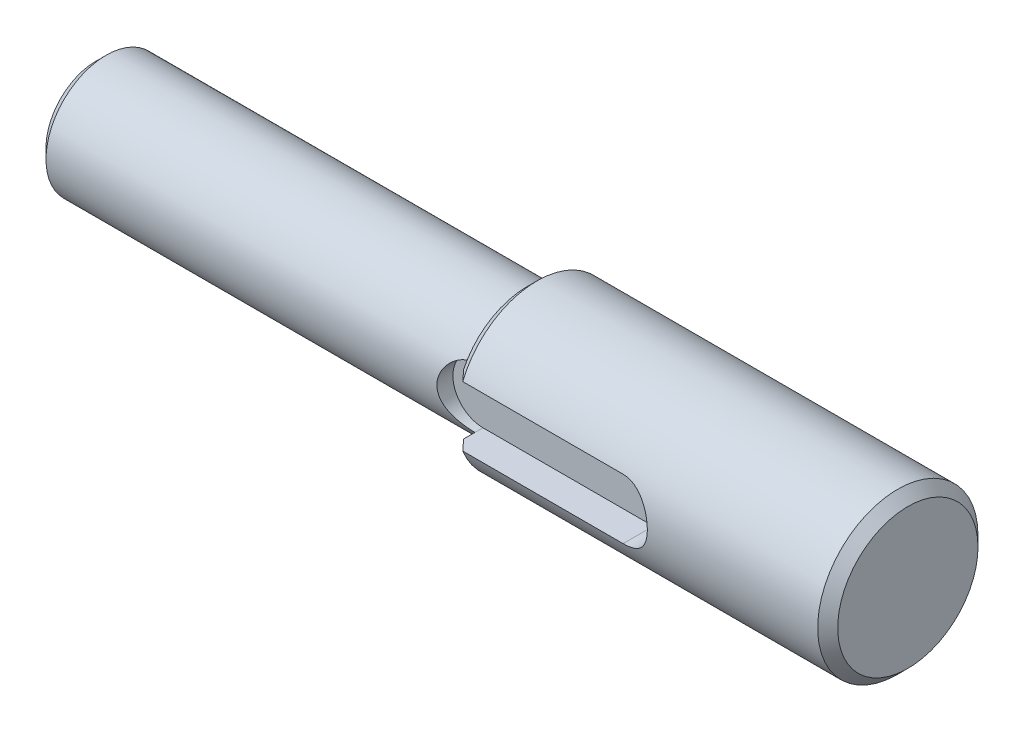
ISO-10303-21;
HEADER;
FILE_DESCRIPTION(('STEP AP214'),'2;1');
FILE_NAME('part.step','',(''),(''),'','','');
FILE_SCHEMA(('AUTOMOTIVE_DESIGN { 1 0 10303 214 1 1 1 1 }'));
ENDSEC;
DATA;
#1=APPLICATION_CONTEXT('core data for automotive mechanical design processes');
#2=APPLICATION_PROTOCOL_DEFINITION('international standard','automotive_design',2000,#1);
#3=PRODUCT_CONTEXT('',#1,'mechanical');
#4=PRODUCT('Part','Part','',(#3));
#5=PRODUCT_RELATED_PRODUCT_CATEGORY('part','',(#4));
#6=PRODUCT_DEFINITION_FORMATION('','',#4);
#7=PRODUCT_DEFINITION_CONTEXT('part definition',#1,'design');
#8=PRODUCT_DEFINITION('design','',#6,#7);
#9=PRODUCT_DEFINITION_SHAPE('','',#8);
#10=(LENGTH_UNIT() NAMED_UNIT(*) SI_UNIT(.MILLI.,.METRE.));
#11=(NAMED_UNIT(*) PLANE_ANGLE_UNIT() SI_UNIT($,.RADIAN.));
#12=(NAMED_UNIT(*) SI_UNIT($,.STERADIAN.) SOLID_ANGLE_UNIT());
#13=UNCERTAINTY_MEASURE_WITH_UNIT(LENGTH_MEASURE(1.E-05),#10,'distance_accuracy_value','');
#14=(GEOMETRIC_REPRESENTATION_CONTEXT(3) GLOBAL_UNCERTAINTY_ASSIGNED_CONTEXT((#13)) GLOBAL_UNIT_ASSIGNED_CONTEXT((#10,
#11,#12)) REPRESENTATION_CONTEXT('',''));
#15=CARTESIAN_POINT('',(0.,0.,0.));
#16=DIRECTION('',(0.,0.,1.));
#17=DIRECTION('',(1.,0.,0.));
#18=AXIS2_PLACEMENT_3D('',#15,#16,#17);
#19=CARTESIAN_POINT('',(-21.5,0.,0.));
#20=DIRECTION('',(1.,0.,0.));
#21=DIRECTION('',(0.,0.,-1.));
#22=AXIS2_PLACEMENT_3D('',#19,#20,#21);
#23=PLANE('',#22);
#24=CARTESIAN_POINT('',(-21.5,0.,0.));
#25=DIRECTION('',(1.,0.,0.));
#26=DIRECTION('',(0.,0.,-1.));
#27=AXIS2_PLACEMENT_3D('',#24,#25,#26);
#28=CIRCLE('',#27,2.5);
#29=CARTESIAN_POINT('',(-21.5,0.,-2.5));
#30=VERTEX_POINT('',#29);
#31=EDGE_CURVE('E272',#30,#30,#28,.T.);
#32=ORIENTED_EDGE('',*,*,#31,.F.);
#33=EDGE_LOOP('',(#32));
#34=FACE_BOUND('',#33,.T.);
#35=ADVANCED_FACE('F17',(#34),#23,.F.);
#36=CARTESIAN_POINT('',(-21.5,0.,0.));
#37=DIRECTION('',(1.,0.,0.));
#38=DIRECTION('',(0.,0.,-1.));
#39=AXIS2_PLACEMENT_3D('',#36,#37,#38);
#40=CONICAL_SURFACE('',#39,2.5,0.785398163397448);
#41=CARTESIAN_POINT('',(-21.,0.,0.));
#42=DIRECTION('',(1.,0.,0.));
#43=DIRECTION('',(0.,0.,-1.));
#44=AXIS2_PLACEMENT_3D('',#41,#42,#43);
#45=CIRCLE('',#44,3.);
#46=CARTESIAN_POINT('',(-21.,0.,-3.));
#47=VERTEX_POINT('',#46);
#48=EDGE_CURVE('E100',#47,#47,#45,.T.);
#49=ORIENTED_EDGE('',*,*,#48,.F.);
#50=EDGE_LOOP('',(#49));
#51=FACE_BOUND('',#50,.T.);
#52=ORIENTED_EDGE('',*,*,#31,.T.);
#53=EDGE_LOOP('',(#52));
#54=FACE_BOUND('',#53,.T.);
#55=ADVANCED_FACE('F261',(#51,#54),#40,.T.);
#56=CARTESIAN_POINT('',(19.,0.,0.));
#57=DIRECTION('',(1.,0.,0.));
#58=DIRECTION('',(0.,0.,-1.));
#59=AXIS2_PLACEMENT_3D('',#56,#57,#58);
#60=CYLINDRICAL_SURFACE('',#59,3.);
#61=CARTESIAN_POINT('',(0.,0.,0.));
#62=DIRECTION('',(1.,0.,0.));
#63=DIRECTION('',(0.,-0.5,0.866025403784439));
#64=AXIS2_PLACEMENT_3D('',#61,#62,#63);
#65=CIRCLE('',#64,3.);
#66=CARTESIAN_POINT('',(0.,-1.5,2.59807621135332));
#67=VERTEX_POINT('',#66);
#68=CARTESIAN_POINT('',(0.,1.5,2.59807621135332));
#69=VERTEX_POINT('',#68);
#70=EDGE_CURVE('E90',#67,#69,#65,.T.);
#71=ORIENTED_EDGE('',*,*,#70,.F.);
#72=CARTESIAN_POINT('',(0.,-1.5,2.59807621135332));
#73=CARTESIAN_POINT('',(-0.0201112014637053,-1.50000100424477,2.59807509935706));
#74=CARTESIAN_POINT('',(-0.0402226672694407,-1.49960302854677,2.59830538391369));
#75=CARTESIAN_POINT('',(-0.0802807859656594,-1.49801007236791,2.59922438399097));
#76=CARTESIAN_POINT('',(-0.100227696918947,-1.4968199579211,2.59991030055577));
#77=CARTESIAN_POINT('',(-0.139958353968945,-1.49365005017262,2.60173262570743));
#78=CARTESIAN_POINT('',(-0.15974243341424,-1.49167340503666,2.60286723823483));
#79=CARTESIAN_POINT('',(-0.199149104743838,-1.48693808376774,2.60557529275446));
#80=CARTESIAN_POINT('',(-0.218771927976284,-1.48418086390565,2.60714791748638));
#81=CARTESIAN_POINT('',(-0.257857990666692,-1.4778905039031,2.61071881250953));
#82=CARTESIAN_POINT('',(-0.277321195023839,-1.47435719760565,2.61271717394654));
#83=CARTESIAN_POINT('',(-0.316090054861537,-1.46651974116324,2.61712439450217));
#84=CARTESIAN_POINT('',(-0.335395265922529,-1.46221390106466,2.61953415299945));
#85=CARTESIAN_POINT('',(-0.373850394329533,-1.45283550236129,2.62474720634962));
#86=CARTESIAN_POINT('',(-0.392999342530256,-1.44775985415003,2.62755208361777));
#87=CARTESIAN_POINT('',(-0.431140661794992,-1.43684545917524,2.63353641470699));
#88=CARTESIAN_POINT('',(-0.450131499562329,-1.43100249265922,2.63671792948527));
#89=CARTESIAN_POINT('',(-0.487794320244158,-1.4186122830112,2.643404761346));
#90=CARTESIAN_POINT('',(-0.506466704641873,-1.41206601650389,2.64690962847901));
#91=CARTESIAN_POINT('',(-0.543403528671443,-1.39829772719499,2.65420870915732));
#92=CARTESIAN_POINT('',(-0.561669434457148,-1.39107890402635,2.65800153823984));
#93=CARTESIAN_POINT('',(-0.597800431804734,-1.37597034103361,2.66585406423759));
#94=CARTESIAN_POINT('',(-0.615666505613378,-1.368082543935,2.66991298112372));
#95=CARTESIAN_POINT('',(-0.651005129344533,-1.35164048331414,2.67827424962958));
#96=CARTESIAN_POINT('',(-0.668478105293281,-1.34308699103264,2.68257631800906));
#97=CARTESIAN_POINT('',(-0.703037846120985,-1.32531774812303,2.69139950516503));
#98=CARTESIAN_POINT('',(-0.720124431961173,-1.31610169843395,2.69592072255584));
#99=CARTESIAN_POINT('',(-0.753918860223004,-1.29701152117556,2.70515688306169));
#100=CARTESIAN_POINT('',(-0.770625893282489,-1.28713613724538,2.70987218905733));
#101=CARTESIAN_POINT('',(-0.8036683035378,-1.26673091284626,2.71947059729999));
#102=CARTESIAN_POINT('',(-0.820002236970717,-1.25619897714018,2.72435421190229));
#103=CARTESIAN_POINT('',(-0.852295348741461,-1.23449398477226,2.73425811832046));
#104=CARTESIAN_POINT('',(-0.868252791527226,-1.22331855954291,2.73927887389637));
#105=CARTESIAN_POINT('',(-0.899670997084989,-1.20041798746725,2.74939137959274));
#106=CARTESIAN_POINT('',(-0.915133043370813,-1.18869449445761,2.75448288718903));
#107=CARTESIAN_POINT('',(-0.945523433842262,-1.16471530107059,2.76470748252136));
#108=CARTESIAN_POINT('',(-0.960453576014092,-1.15246178221176,2.76984034004282));
#109=CARTESIAN_POINT('',(-0.98978326539719,-1.12742066362937,2.78012687015357));
#110=CARTESIAN_POINT('',(-1.00418403548072,-1.11463446225715,2.7852804596716));
#111=CARTESIAN_POINT('',(-1.03245741370812,-1.08852544585858,2.79558743157745));
#112=CARTESIAN_POINT('',(-1.04633061842768,-1.07520327427095,2.80074080719261));
#113=CARTESIAN_POINT('',(-1.07355155215982,-1.04802034063869,2.8110255351538));
#114=CARTESIAN_POINT('',(-1.08689920822183,-1.03415950434974,2.81615688435492));
#115=CARTESIAN_POINT('',(-1.11307169090318,-1.00589753341478,2.82637510785326));
#116=CARTESIAN_POINT('',(-1.12589574412853,-0.991495655866689,2.83146190822134));
#117=CARTESIAN_POINT('',(-1.15102381133361,-0.962150351066412,2.84156790673035));
#118=CARTESIAN_POINT('',(-1.16332633343732,-0.947205571121614,2.8465868861846));
#119=CARTESIAN_POINT('',(-1.18741375470426,-0.91677346488857,2.85653350154787));
#120=CARTESIAN_POINT('',(-1.19919643677951,-0.901284242186211,2.86146070248774));
#121=CARTESIAN_POINT('',(-1.22219438240772,-0.869836784793221,2.8711765883159));
#122=CARTESIAN_POINT('',(-1.23340939654843,-0.8538783487329,2.87596521192944));
#123=CARTESIAN_POINT('',(-1.25518649438533,-0.821586378608998,2.88535563960394));
#124=CARTESIAN_POINT('',(-1.26575146087651,-0.805255019603921,2.88995823190844));
#125=CARTESIAN_POINT('',(-1.28622254332632,-0.772215734337836,2.89896101302317));
#126=CARTESIAN_POINT('',(-1.29613089900258,-0.755509379426151,2.90336187222393));
#127=CARTESIAN_POINT('',(-1.31528391049468,-0.721718653316975,2.91194528569483));
#128=CARTESIAN_POINT('',(-1.32453003912815,-0.704635238994043,2.91612831837662));
#129=CARTESIAN_POINT('',(-1.34235371879005,-0.670089318823677,2.9242597158576));
#130=CARTESIAN_POINT('',(-1.35093188479511,-0.652627181061541,2.92820829569673));
#131=CARTESIAN_POINT('',(-1.36741487530633,-0.617323202853023,2.93585395008993));
#132=CARTESIAN_POINT('',(-1.37531937465041,-0.599481184182345,2.93955090301854));
#133=CARTESIAN_POINT('',(-1.39045036889715,-0.563417313877201,2.94667599410556));
#134=CARTESIAN_POINT('',(-1.39767552855948,-0.54519479683288,2.95010360078011));
#135=CARTESIAN_POINT('',(-1.41144313079173,-0.508370235965486,2.95667223089246));
#136=CARTESIAN_POINT('',(-1.41798317282327,-0.48976711387918,2.95981224211209));
#137=CARTESIAN_POINT('',(-1.43037631615423,-0.452182372516606,2.96578740463279));
#138=CARTESIAN_POINT('',(-1.43622591596271,-0.433199350909844,2.96862099635676));
#139=CARTESIAN_POINT('',(-1.44720501999723,-0.394950732423706,2.97395146346806));
#140=CARTESIAN_POINT('',(-1.45233352962622,-0.375684784958155,2.97644787359883));
#141=CARTESIAN_POINT('',(-1.46180874365601,-0.337021919459879,2.98107251356635));
#142=CARTESIAN_POINT('',(-1.46615925904926,-0.317626151335175,2.98320253607302));
#143=CARTESIAN_POINT('',(-1.47407676856719,-0.278712461877734,2.98708893616656));
#144=CARTESIAN_POINT('',(-1.47764656242713,-0.259195244047539,2.98884664815241));
#145=CARTESIAN_POINT('',(-1.48400025961895,-0.220045243679387,2.99198344111327));
#146=CARTESIAN_POINT('',(-1.48678579613418,-0.200412789528316,2.99336330876652));
#147=CARTESIAN_POINT('',(-1.49156907013254,-0.161039124955087,2.99573950497952));
#148=CARTESIAN_POINT('',(-1.4935672066984,-0.141297974781913,2.99673602782614));
#149=CARTESIAN_POINT('',(-1.49677367738769,-0.101713789888175,2.99834072587009));
#150=CARTESIAN_POINT('',(-1.49798113225816,-0.0818706663907698,2.99894846871946));
#151=CARTESIAN_POINT('',(-1.499604513142,-0.0420894810053159,2.99977088501034));
#152=CARTESIAN_POINT('',(-1.50001826190318,-0.0221513079499127,2.99998447717794));
#153=CARTESIAN_POINT('',(-1.50005170619073,0.0178128927553851,3.00001395496849));
#154=CARTESIAN_POINT('',(-1.4996679286447,0.0378389240962725,2.99982810096015));
#155=CARTESIAN_POINT('',(-1.49810798937332,0.077941285816747,2.99905470760403));
#156=CARTESIAN_POINT('',(-1.49692831875149,0.0980174450174121,2.99846538931114));
#157=CARTESIAN_POINT('',(-1.49378020160178,0.138021601136471,2.99688994407996));
#158=CARTESIAN_POINT('',(-1.49181452364543,0.1579498706254,2.99590520987353));
#159=CARTESIAN_POINT('',(-1.48709917059581,0.197618270451543,2.99354979889375));
#160=CARTESIAN_POINT('',(-1.48435231412973,0.217358818156621,2.99218050987832));
#161=CARTESIAN_POINT('',(-1.47808188123682,0.256645754299405,2.98906682381521));
#162=CARTESIAN_POINT('',(-1.4745598624474,0.276192451098976,2.98732317918016));
#163=CARTESIAN_POINT('',(-1.46674572391062,0.315086137146069,2.98347154440133));
#164=CARTESIAN_POINT('',(-1.46245393691652,0.334433208880405,2.98136371170212));
#165=CARTESIAN_POINT('',(-1.45310694146016,0.372922562790242,2.97679437723478));
#166=CARTESIAN_POINT('',(-1.44805089665095,0.39206459570439,2.97433248815882));
#167=CARTESIAN_POINT('',(-1.43718222462825,0.430139357544319,2.9690655854821));
#168=CARTESIAN_POINT('',(-1.4313676677561,0.449071414264901,2.96625969788207));
#169=CARTESIAN_POINT('',(-1.41898772855101,0.486721744849177,2.9603152969595));
#170=CARTESIAN_POINT('',(-1.41241941092482,0.505438847663753,2.95717548700783));
#171=CARTESIAN_POINT('',(-1.39856902051412,0.542582657652845,2.95058643482347));
#172=CARTESIAN_POINT('',(-1.39128594679631,0.561008914405412,2.94713675924904));
#173=CARTESIAN_POINT('',(-1.37605600705663,0.597442074524336,2.93996705432517));
#174=CARTESIAN_POINT('',(-1.36811191421913,0.615450361043698,2.93624816219882));
#175=CARTESIAN_POINT('',(-1.35156505818463,0.651045628392308,2.92856111953574));
#176=CARTESIAN_POINT('',(-1.34296414587767,0.668633622186093,2.92459367470041));
#177=CARTESIAN_POINT('',(-1.32511006313099,0.70339002696243,2.91642944687024));
#178=CARTESIAN_POINT('',(-1.31585777600513,0.720558965208009,2.91223297612506));
#179=CARTESIAN_POINT('',(-1.29670677784973,0.754479402684737,2.90362997044148));
#180=CARTESIAN_POINT('',(-1.2868080406241,0.771230884961275,2.89922342699225));
#181=CARTESIAN_POINT('',(-1.26637000045828,0.804319131870732,2.89021887301068));
#182=CARTESIAN_POINT('',(-1.25582983100006,0.820655291247976,2.8856206062396));
#183=CARTESIAN_POINT('',(-1.23411489230394,0.852916290371506,2.87625045819828));
#184=CARTESIAN_POINT('',(-1.22293849585203,0.868839908557833,2.87147814410338));
#185=CARTESIAN_POINT('',(-1.19995698859208,0.900277896242995,2.86177766713942));
#186=CARTESIAN_POINT('',(-1.18814961518309,0.915790446541743,2.85684897329787));
#187=CARTESIAN_POINT('',(-1.16398973007215,0.946317667618762,2.84688255717679));
#188=CARTESIAN_POINT('',(-1.15163786686602,0.96133289526318,2.84184496805437));
#189=CARTESIAN_POINT('',(-1.12643113813019,0.990802403622658,2.83170487119702));
#190=CARTESIAN_POINT('',(-1.11357846678184,1.00525867654325,2.8266027010373));
#191=CARTESIAN_POINT('',(-1.0873675088143,1.03361195280114,2.81635809614115));
#192=CARTESIAN_POINT('',(-1.07401070749737,1.04751038285743,2.81121581044033));
#193=CARTESIAN_POINT('',(-1.04678909708489,1.07475044341945,2.80091471064335));
#194=CARTESIAN_POINT('',(-1.03292506425856,1.08809286298607,2.79575593199264));
#195=CARTESIAN_POINT('',(-1.00468655163129,1.11422380687794,2.78544477087064));
#196=CARTESIAN_POINT('',(-0.990312153262692,1.12701241885065,2.78029238751351));
#197=CARTESIAN_POINT('',(-0.961050411665466,1.15203901224231,2.77001612415707));
#198=CARTESIAN_POINT('',(-0.946162482628377,1.16427632544531,2.76489228501247));
#199=CARTESIAN_POINT('',(-0.91587135481681,1.18820420384768,2.7546942357672));
#200=CARTESIAN_POINT('',(-0.900466944089681,1.19989330243918,2.74962018464679));
#201=CARTESIAN_POINT('',(-0.869139702137436,1.22272789220163,2.73954246096364));
#202=CARTESIAN_POINT('',(-0.853215082844132,1.2338710846687,2.73453914019975));
#203=CARTESIAN_POINT('',(-0.820887488981846,1.25559395726282,2.72463330677332));
#204=CARTESIAN_POINT('',(-0.804483315365328,1.2661719970604,2.71973111048548));
#205=CARTESIAN_POINT('',(-0.771334866560534,1.28666341516112,2.7100968206274));
#206=CARTESIAN_POINT('',(-0.754592675344314,1.29657982270754,2.70536400552146));
#207=CARTESIAN_POINT('',(-0.72077328446088,1.31573293307072,2.69610080210206));
#208=CARTESIAN_POINT('',(-0.703697917234222,1.32497247655168,2.69156960336513));
#209=CARTESIAN_POINT('',(-0.669206939021555,1.34276947818909,2.68273526925034));
#210=CARTESIAN_POINT('',(-0.651792529394324,1.35132893746969,2.67843147828012));
#211=CARTESIAN_POINT('',(-0.616617598897705,1.36776264009854,2.67007681777293));
#212=CARTESIAN_POINT('',(-0.59885764896778,1.37563791281965,2.66602557096646));
#213=CARTESIAN_POINT('',(-0.562985945404169,1.39070033644173,2.65819950792311));
#214=CARTESIAN_POINT('',(-0.544874154435368,1.39788741383074,2.65442472122738));
#215=CARTESIAN_POINT('',(-0.508292988833742,1.41157028026713,2.64717385517741));
#216=CARTESIAN_POINT('',(-0.489823017345353,1.41806477246642,2.64369833846197));
#217=CARTESIAN_POINT('',(-0.452519720555867,1.43035936793811,2.63706674976402));
#218=CARTESIAN_POINT('',(-0.433685314134413,1.43615684709896,2.633911891484));
#219=CARTESIAN_POINT('',(-0.395647099212452,1.44705287787596,2.62794155415698));
#220=CARTESIAN_POINT('',(-0.376441824286575,1.45214738900119,2.62512804743804));
#221=CARTESIAN_POINT('',(-0.337704056176089,1.46162488246592,2.61986300594902));
#222=CARTESIAN_POINT('',(-0.318170410361565,1.46600419851222,2.61741334180201));
#223=CARTESIAN_POINT('',(-0.278963453432823,1.473973504853,2.61293378851361));
#224=CARTESIAN_POINT('',(-0.259290827487602,1.47756608482822,2.61090252349062));
#225=CARTESIAN_POINT('',(-0.21982786518586,1.48395691578814,2.60727546473947));
#226=CARTESIAN_POINT('',(-0.200037946031714,1.48675713004266,2.60567859508273));
#227=CARTESIAN_POINT('',(-0.16033974972564,1.49156204855582,2.60293109181371));
#228=CARTESIAN_POINT('',(-0.140431529005009,1.49356710534661,2.60178026045601));
#229=CARTESIAN_POINT('',(-0.100496137093435,1.49677949206584,2.59993361364738));
#230=CARTESIAN_POINT('',(-0.0804688224750573,1.49798547955428,2.59923856393175));
#231=CARTESIAN_POINT('',(-0.0402944283335408,1.49959779189025,2.59830840796257));
#232=CARTESIAN_POINT('',(-0.0201471839799657,1.50000103416758,2.59807507473727));
#233=CARTESIAN_POINT('',(0.,1.5,2.59807621135332));
#234=B_SPLINE_CURVE_WITH_KNOTS('',3,(#72,#73,#74,#75,#76,#77,#78,#79,#80,#81,#82,#83,#84,#85,
#86,#87,#88,#89,#90,#91,#92,#93,#94,#95,#96,#97,#98,#99,#100,#101,#102,#103,#104,#105,#106,#107,
#108,#109,#110,#111,#112,#113,#114,#115,#116,#117,#118,#119,#120,#121,#122,#123,#124,#125,#126,
#127,#128,#129,#130,#131,#132,#133,#134,#135,#136,#137,#138,#139,#140,#141,#142,#143,#144,#145,
#146,#147,#148,#149,#150,#151,#152,#153,#154,#155,#156,#157,#158,#159,#160,#161,#162,#163,#164,
#165,#166,#167,#168,#169,#170,#171,#172,#173,#174,#175,#176,#177,#178,#179,#180,#181,#182,#183,
#184,#185,#186,#187,#188,#189,#190,#191,#192,#193,#194,#195,#196,#197,#198,#199,#200,#201,#202,
#203,#204,#205,#206,#207,#208,#209,#210,#211,#212,#213,#214,#215,#216,#217,#218,#219,#220,#221,
#222,#223,#224,#225,#226,#227,#228,#229,#230,#231,#232,#233),.UNSPECIFIED.,.F.,.F.,(4,2,2,2,2,2,
2,2,2,2,2,2,2,2,2,2,2,2,2,2,2,2,2,2,2,2,2,2,2,2,2,2,2,2,2,2,2,2,2,2,2,2,2,2,2,2,2,2,2,2,2,2,2,2,
2,2,2,2,2,2,2,2,2,2,2,2,2,2,2,2,2,2,2,2,2,2,2,2,2,2,4),(0.,0.0603286718006961,0.12029012897153,
0.180013960596132,0.239627095177555,0.299253005153278,0.359010976231464,0.4190154619503,
0.479364952128395,0.539631696555571,0.599625094719574,0.659449873562519,0.719206345695307,
0.778989961754346,0.838890939476029,0.898993974277732,0.959334466081454,1.01950334580654,
1.07944456769108,1.13923728985218,1.19896025531207,1.258691481804,1.3185079592548,
1.37848536073166,1.43869777209783,1.49893641292971,1.55888512117996,1.61861752254533,
1.67821266277306,1.73775227005644,1.79732045475743,1.85700337469581,1.91688887218691,
1.97706609023677,2.03732551293202,2.09728114837008,2.15701811781333,2.21662975151193,
2.27621113290212,2.33585865790253,2.39566957213547,2.45574149703351,2.51608001004193,
2.57620783753531,2.63612140763983,2.69591566706591,2.75568414081948,2.81551850071124,
2.87550816147723,2.93573991296226,2.99605724945409,3.05613319246955,3.11604568329215,
3.17587843757939,3.23571361797451,3.29563150640139,3.35571020180053,3.41602105433021,
3.47626192020916,3.53626337073545,3.59610006071968,3.6558487213361,3.71558789110927,
3.77539762150121,3.83535916229469,3.895554632796,3.95591625734268,4.01597926892332,
4.07577374571446,4.13538520758268,4.1949053708059,4.25443188480565,4.31406797279088,
4.37392197922491,4.43410683158451,4.49459113083692,4.55487323852254,4.61500464862971,
4.67510936966253,4.73531481258089,4.79575100398663),.UNSPECIFIED.);
#235=EDGE_CURVE('E98',#67,#69,#234,.T.);
#236=ORIENTED_EDGE('',*,*,#235,.T.);
#237=EDGE_LOOP('',(#71,#236));
#238=FACE_BOUND('',#237,.T.);
#239=ORIENTED_EDGE('',*,*,#48,.T.);
#240=EDGE_LOOP('',(#239));
#241=FACE_BOUND('',#240,.T.);
#242=ADVANCED_FACE('F96',(#238,#241),#60,.T.);
#243=CARTESIAN_POINT('',(0.,3.,0.));
#244=DIRECTION('',(1.,0.,0.));
#245=DIRECTION('',(0.,0.,-1.));
#246=AXIS2_PLACEMENT_3D('',#243,#244,#245);
#247=PLANE('',#246);
#248=CARTESIAN_POINT('',(0.,0.,0.));
#249=DIRECTION('',(1.,0.,0.));
#250=DIRECTION('',(0.,-0.428571428571429,0.903507902905251));
#251=AXIS2_PLACEMENT_3D('',#248,#249,#250);
#252=CIRCLE('',#251,3.5);
#253=CARTESIAN_POINT('',(0.,-1.5,3.16227766016838));
#254=VERTEX_POINT('',#253);
#255=CARTESIAN_POINT('',(0.,1.5,3.16227766016838));
#256=VERTEX_POINT('',#255);
#257=EDGE_CURVE('E92',#254,#256,#252,.T.);
#258=ORIENTED_EDGE('',*,*,#257,.F.);
#259=DIRECTION('',(0.,0.,1.));
#260=VECTOR('',#259,1.);
#261=CARTESIAN_POINT('',(0.,-1.5,2.59807621135332));
#262=LINE('',#261,#260);
#263=EDGE_CURVE('E73',#67,#254,#262,.T.);
#264=ORIENTED_EDGE('',*,*,#263,.F.);
#265=ORIENTED_EDGE('',*,*,#70,.T.);
#266=DIRECTION('',(0.,0.,1.));
#267=VECTOR('',#266,1.);
#268=CARTESIAN_POINT('',(0.,1.5,2.59807621135332));
#269=LINE('',#268,#267);
#270=EDGE_CURVE('E82',#69,#256,#269,.T.);
#271=ORIENTED_EDGE('',*,*,#270,.T.);
#272=EDGE_LOOP('',(#258,#264,#265,#271));
#273=FACE_BOUND('',#272,.T.);
#274=ADVANCED_FACE('F88',(#273),#247,.F.);
#275=CARTESIAN_POINT('',(0.,0.,2.2));
#276=DIRECTION('',(0.,0.,1.));
#277=DIRECTION('',(1.,0.,0.));
#278=AXIS2_PLACEMENT_3D('',#275,#276,#277);
#279=CYLINDRICAL_SURFACE('',#278,1.5);
#280=DIRECTION('',(0.,0.,1.));
#281=VECTOR('',#280,1.);
#282=CARTESIAN_POINT('',(0.,-1.5,2.2));
#283=LINE('',#282,#281);
#284=CARTESIAN_POINT('',(0.,-1.5,2.2));
#285=VERTEX_POINT('',#284);
#286=EDGE_CURVE('E68',#285,#67,#283,.T.);
#287=ORIENTED_EDGE('',*,*,#286,.F.);
#288=CARTESIAN_POINT('',(0.,0.,2.2));
#289=DIRECTION('',(0.,0.,1.));
#290=DIRECTION('',(0.,1.,0.));
#291=AXIS2_PLACEMENT_3D('',#288,#289,#290);
#292=CIRCLE('',#291,1.5);
#293=CARTESIAN_POINT('',(0.,1.5,2.2));
#294=VERTEX_POINT('',#293);
#295=EDGE_CURVE('E81',#294,#285,#292,.T.);
#296=ORIENTED_EDGE('',*,*,#295,.F.);
#297=DIRECTION('',(0.,0.,1.));
#298=VECTOR('',#297,1.);
#299=CARTESIAN_POINT('',(0.,1.5,2.2));
#300=LINE('',#299,#298);
#301=EDGE_CURVE('E106',#294,#69,#300,.T.);
#302=ORIENTED_EDGE('',*,*,#301,.T.);
#303=ORIENTED_EDGE('',*,*,#235,.F.);
#304=EDGE_LOOP('',(#287,#296,#302,#303));
#305=FACE_BOUND('',#304,.T.);
#306=ADVANCED_FACE('F104',(#305),#279,.F.);
#307=CARTESIAN_POINT('',(0.,0.,0.));
#308=DIRECTION('',(1.,0.,0.));
#309=DIRECTION('',(0.,0.,-1.));
#310=AXIS2_PLACEMENT_3D('',#307,#308,#309);
#311=CONICAL_SURFACE('',#310,3.5,0.785398163397448);
#312=CARTESIAN_POINT('',(0.5,0.,0.));
#313=DIRECTION('',(1.,0.,0.));
#314=DIRECTION('',(0.,-0.375,0.927024810886958));
#315=AXIS2_PLACEMENT_3D('',#312,#313,#314);
#316=CIRCLE('',#315,4.);
#317=CARTESIAN_POINT('',(0.5,-1.5,3.70809924354783));
#318=VERTEX_POINT('',#317);
#319=CARTESIAN_POINT('',(0.5,1.5,3.70809924354783));
#320=VERTEX_POINT('',#319);
#321=EDGE_CURVE('E115',#318,#320,#316,.T.);
#322=ORIENTED_EDGE('',*,*,#321,.F.);
#323=CARTESIAN_POINT('',(0.499999968381832,-1.5,3.70809920944069));
#324=CARTESIAN_POINT('',(0.49471628093061,-1.49999999799894,3.70239959183085));
#325=CARTESIAN_POINT('',(0.489433488968269,-1.4999998691006,3.69669914405713));
#326=CARTESIAN_POINT('',(0.478877962928648,-1.49999943963857,3.68530543071832));
#327=CARTESIAN_POINT('',(0.473605226000678,-1.49999913934256,3.6796121677942));
#328=CARTESIAN_POINT('',(0.463069135515041,-1.49999844919124,3.66823203234655));
#329=CARTESIAN_POINT('',(0.457805779297591,-1.49999805946423,3.66254516228555));
#330=CARTESIAN_POINT('',(0.447287775295967,-1.49999725747354,3.65117702311606));
#331=CARTESIAN_POINT('',(0.442033125055251,-1.49999684523967,3.64549575628042));
#332=CARTESIAN_POINT('',(0.431531858168622,-1.49999605392943,3.63413803601919));
#333=CARTESIAN_POINT('',(0.426285239280401,-1.4999956748151,3.62846158466682));
#334=CARTESIAN_POINT('',(0.415799360220298,-1.49999499305793,3.61711270992196));
#335=CARTESIAN_POINT('',(0.410560098030918,-1.49999469033682,3.61144028839357));
#336=CARTESIAN_POINT('',(0.400088257487988,-1.49999419252795,3.60009868995646));
#337=CARTESIAN_POINT('',(0.394855677351637,-1.49999399734401,3.59442951469385));
#338=CARTESIAN_POINT('',(0.384396526022373,-1.49999373349616,3.58309362762416));
#339=CARTESIAN_POINT('',(0.379169953290583,-1.49999366473585,3.57742691723695));
#340=CARTESIAN_POINT('',(0.368722141871488,-1.49999366032235,3.56609518098371));
#341=CARTESIAN_POINT('',(0.363500901897754,-1.49999372458537,3.56043015630377));
#342=CARTESIAN_POINT('',(0.353063081081833,-1.49999398040917,3.54910101482844));
#343=CARTESIAN_POINT('',(0.347846499213456,-1.49999417190673,3.54343689897851));
#344=CARTESIAN_POINT('',(0.337417319709902,-1.49999466406004,3.53210880086174));
#345=CARTESIAN_POINT('',(0.33220472131579,-1.49999496467611,3.5264448192936));
#346=CARTESIAN_POINT('',(0.321782833774607,-1.49999564405516,3.51511621793409));
#347=CARTESIAN_POINT('',(0.316573544142113,-1.49999602280015,3.50945159858929));
#348=CARTESIAN_POINT('',(0.306157599435649,-1.499996816252,3.49812095208089));
#349=CARTESIAN_POINT('',(0.300950944155129,-1.49999723095538,3.49245492510716));
#350=CARTESIAN_POINT('',(0.290539592327377,-1.4999980362873,3.48112069734256));
#351=CARTESIAN_POINT('',(0.285334895857052,-1.49999842691496,3.47545249648105));
#352=CARTESIAN_POINT('',(0.274926790044573,-1.49999913076458,3.46411315370405));
#353=CARTESIAN_POINT('',(0.269723381066946,-1.49999944397347,3.45844201145397));
#354=CARTESIAN_POINT('',(0.259317162863509,-1.49999985430905,3.44709603582761));
#355=CARTESIAN_POINT('',(0.254114354288775,-1.49999995137072,3.44142120185418));
#356=CARTESIAN_POINT('',(0.243707942547395,-1.50000004865748,3.4300662058885));
#357=CARTESIAN_POINT('',(0.238504340669745,-1.50000004882639,3.42438604271493));
#358=CARTESIAN_POINT('',(0.228096218564234,-1.50000011846692,3.41302011074671));
#359=CARTESIAN_POINT('',(0.222891699751679,-1.50000018798131,3.407334340656));
#360=CARTESIAN_POINT('',(0.212482956693371,-1.50000030493891,3.395958488863));
#361=CARTESIAN_POINT('',(0.207278733340581,-1.50000035237355,3.39026840634364));
#362=CARTESIAN_POINT('',(0.196871809926558,-1.50000041982822,3.37888520649098));
#363=CARTESIAN_POINT('',(0.191669110233312,-1.50000043984392,3.37319208882123));
#364=CARTESIAN_POINT('',(0.181266458600643,-1.50000044104272,3.36180409654192));
#365=CARTESIAN_POINT('',(0.176066506490163,-1.50000042222861,3.35610922208861));
#366=CARTESIAN_POINT('',(0.165670575782434,-1.50000035399519,3.34471898999634));
#367=CARTESIAN_POINT('',(0.160474596460217,-1.50000030458509,3.33902363301907));
#368=CARTESIAN_POINT('',(0.150087836246657,-1.50000019348379,3.32763370736472));
#369=CARTESIAN_POINT('',(0.144897054059667,-1.50000013179912,3.32193913986919));
#370=CARTESIAN_POINT('',(0.134521915196387,-1.50000003813273,3.31055205955029));
#371=CARTESIAN_POINT('',(0.129337556633071,-1.50000000612851,3.30485954844626));
#372=CARTESIAN_POINT('',(0.118971740329751,-1.49999999387194,3.29347263964756));
#373=CARTESIAN_POINT('',(0.113790282406843,-1.50000001361583,3.2877782421194));
#374=CARTESIAN_POINT('',(0.103427167325011,-1.50000004064153,3.27638411047148));
#375=CARTESIAN_POINT('',(0.0982455115170212,-1.50000004791673,3.27068437512302));
#376=CARTESIAN_POINT('',(0.0878838778829968,-1.50000004877606,3.25928155289238));
#377=CARTESIAN_POINT('',(0.0827039005110813,-1.5000000423578,3.25357846559755));
#378=CARTESIAN_POINT('',(0.0723474948822123,-1.50000001217117,3.24217092485356));
#379=CARTESIAN_POINT('',(0.0671710661570298,-1.4999999884059,3.23646647182949));
#380=CARTESIAN_POINT('',(0.0568196025098516,-1.50000001159699,3.2250537089976));
#381=CARTESIAN_POINT('',(0.0516445682570418,-1.50000005857099,3.21934539858282));
#382=CARTESIAN_POINT('',(0.0412962408987075,-1.50000014228853,3.20792525987167));
#383=CARTESIAN_POINT('',(0.0361229482982529,-1.50000017903016,3.20221343111765));
#384=CARTESIAN_POINT('',(0.0257837542754638,-1.50000017865191,3.19079244481953));
#385=CARTESIAN_POINT('',(0.0206178503926796,-1.50000014159852,3.18508328950286));
#386=CARTESIAN_POINT('',(0.0102990937260629,-1.50000005998761,3.1736738111895));
#387=CARTESIAN_POINT('',(0.00514623541153281,-1.50000001544517,3.16797349319478));
#388=CARTESIAN_POINT('',(-5.20760231292883E-06,-1.5,3.16227189640785));
#389=B_SPLINE_CURVE_WITH_KNOTS('',3,(#323,#324,#325,#326,#327,#328,#329,#330,#331,#332,#333,
#334,#335,#336,#337,#338,#339,#340,#341,#342,#343,#344,#345,#346,#347,#348,#349,#350,#351,#352,
#353,#354,#355,#356,#357,#358,#359,#360,#361,#362,#363,#364,#365,#366,#367,#368,#369,#370,#371,
#372,#373,#374,#375,#376,#377,#378,#379,#380,#381,#382,#383,#384,#385,#386,#387,#388),
.UNSPECIFIED.,.F.,.F.,(4,2,2,2,2,2,2,2,2,2,2,2,2,2,2,2,2,2,2,2,2,2,2,2,2,2,2,2,2,2,2,2,4),(0.,
0.0233158088534419,0.0465953053881055,0.0698416098138448,0.0930578381736383,0.116247102234057,
0.139412509368093,0.162557162430646,0.185684159626955,0.208796594374314,0.231897555157363,
0.254990125377319,0.278077383195501,0.301162401371498,0.32424824709637,0.347337981821251,
0.370434661081754,0.393544734800891,0.416669071528395,0.439802354658173,0.462939273759258,
0.486074524816978,0.509202810478024,0.532318840300097,0.555417331006864,0.578514148741563,
0.60162321240661,0.624736331955304,0.647845329105466,0.670960087289037,0.694079158557026,
0.717177407717395,0.740229742213043),.UNSPECIFIED.);
#390=EDGE_CURVE('E164',#318,#254,#389,.T.);
#391=ORIENTED_EDGE('',*,*,#390,.T.);
#392=ORIENTED_EDGE('',*,*,#257,.T.);
#393=CARTESIAN_POINT('',(1.05171160669215E-08,1.49999999999992,3.16227767180873));
#394=CARTESIAN_POINT('',(0.0102685668570085,1.50000003423623,3.17364285884802));
#395=CARTESIAN_POINT('',(0.0205428074330402,1.50000046080873,3.18500290928865));
#396=CARTESIAN_POINT('',(0.0411365402783019,1.50000163677812,3.20775100625468));
#397=CARTESIAN_POINT('',(0.0514560691254793,1.50000238724777,3.21913901966663));
#398=CARTESIAN_POINT('',(0.0721328616167218,1.50000374451312,3.24193538508468));
#399=CARTESIAN_POINT('',(0.0824901531259008,1.50000435092579,3.2533437118157));
#400=CARTESIAN_POINT('',(0.103234970559878,1.5000051824511,3.27617298951094));
#401=CARTESIAN_POINT('',(0.1136225162965,1.50000540682712,3.28759392247202));
#402=CARTESIAN_POINT('',(0.134420334846643,1.50000538639149,3.31044066463126));
#403=CARTESIAN_POINT('',(0.144830619914186,1.50000514100493,3.32186646267417));
#404=CARTESIAN_POINT('',(0.165666417591544,1.50000429785144,3.34471514277845));
#405=CARTESIAN_POINT('',(0.176091935323965,1.50000369989977,3.35613802016841));
#406=CARTESIAN_POINT('',(0.19695067167081,1.50000231052393,3.37897305701385));
#407=CARTESIAN_POINT('',(0.20738388860859,1.50000151913379,3.39038521800086));
#408=CARTESIAN_POINT('',(0.228250595059804,1.50000051585115,3.41319089789711));
#409=CARTESIAN_POINT('',(0.23868407629895,1.50000030345069,3.42458442437721));
#410=CARTESIAN_POINT('',(0.259543968655175,1.4999996970161,3.44734571288308));
#411=CARTESIAN_POINT('',(0.26997036594924,1.49999930326194,3.4587134875775));
#412=CARTESIAN_POINT('',(0.29081803204578,1.49999782829654,3.48142616591198));
#413=CARTESIAN_POINT('',(0.301239289514878,1.49999674799146,3.49277107995495));
#414=CARTESIAN_POINT('',(0.32208313508279,1.49999484319779,3.51544518684041));
#415=CARTESIAN_POINT('',(0.332505717256962,1.49999401853249,3.52677438512932));
#416=CARTESIAN_POINT('',(0.353358573159641,1.49999287626553,3.54942434877728));
#417=CARTESIAN_POINT('',(0.363788846347847,1.49999255863113,3.56074511463378));
#418=CARTESIAN_POINT('',(0.384663471815113,1.49999256809912,3.583385522907));
#419=CARTESIAN_POINT('',(0.395107828722299,1.49999289556676,3.5947051610565));
#420=CARTESIAN_POINT('',(0.416017001784901,1.49999406440407,3.61735067329455));
#421=CARTESIAN_POINT('',(0.426481827457939,1.49999490638924,3.62867653859509));
#422=CARTESIAN_POINT('',(0.447438322681564,1.49999676840094,3.65134190108166));
#423=CARTESIAN_POINT('',(0.457930006300445,1.49999778875062,3.66268138525973));
#424=CARTESIAN_POINT('',(0.478946593480579,1.49999938592629,3.6853814283092));
#425=CARTESIAN_POINT('',(0.489471515236154,1.49999996165418,3.69674197033581));
#426=CARTESIAN_POINT('',(0.499999982759682,1.49999999999996,3.70809922495037));
#427=B_SPLINE_CURVE_WITH_KNOTS('',3,(#393,#394,#395,#396,#397,#398,#399,#400,#401,#402,#403,
#404,#405,#406,#407,#408,#409,#410,#411,#412,#413,#414,#415,#416,#417,#418,#419,#420,#421,#422,
#423,#424,#425,#426),.UNSPECIFIED.,.F.,.F.,(4,2,2,2,2,2,2,2,2,2,2,2,2,2,2,2,4),(0.,
0.0459510203591436,0.0920554136246912,0.138281056576069,0.184595727893586,0.230967114844289,
0.277362819641911,0.323750365541235,0.370097202721361,0.416372726899742,0.462587299729183,
0.508769852552746,0.554949422340903,0.601155145259645,0.647416250675019,0.69376205565846,
0.740221960052866),.UNSPECIFIED.);
#428=EDGE_CURVE('E153',#256,#320,#427,.T.);
#429=ORIENTED_EDGE('',*,*,#428,.T.);
#430=EDGE_LOOP('',(#322,#391,#392,#429));
#431=FACE_BOUND('',#430,.T.);
#432=ADVANCED_FACE('F126',(#431),#311,.T.);
#433=CARTESIAN_POINT('',(0.,-1.5,2.2));
#434=DIRECTION('',(0.,-1.,0.));
#435=DIRECTION('',(0.,0.,-1.));
#436=AXIS2_PLACEMENT_3D('',#433,#434,#435);
#437=PLANE('',#436);
#438=DIRECTION('',(-1.,0.,0.));
#439=VECTOR('',#438,1.);
#440=CARTESIAN_POINT('',(8.5,-1.5,3.70809924354783));
#441=LINE('',#440,#439);
#442=CARTESIAN_POINT('',(8.5,-1.5,3.70809924354783));
#443=VERTEX_POINT('',#442);
#444=EDGE_CURVE('E145',#443,#318,#441,.T.);
#445=ORIENTED_EDGE('',*,*,#444,.F.);
#446=DIRECTION('',(0.,0.,1.));
#447=VECTOR('',#446,1.);
#448=CARTESIAN_POINT('',(8.5,-1.5,2.2));
#449=LINE('',#448,#447);
#450=CARTESIAN_POINT('',(8.5,-1.5,2.2));
#451=VERTEX_POINT('',#450);
#452=EDGE_CURVE('E152',#451,#443,#449,.T.);
#453=ORIENTED_EDGE('',*,*,#452,.F.);
#454=DIRECTION('',(1.,0.,0.));
#455=VECTOR('',#454,1.);
#456=CARTESIAN_POINT('',(0.,-1.5,2.2));
#457=LINE('',#456,#455);
#458=EDGE_CURVE('E77',#285,#451,#457,.T.);
#459=ORIENTED_EDGE('',*,*,#458,.F.);
#460=ORIENTED_EDGE('',*,*,#286,.T.);
#461=ORIENTED_EDGE('',*,*,#263,.T.);
#462=ORIENTED_EDGE('',*,*,#390,.F.);
#463=EDGE_LOOP('',(#445,#453,#459,#460,#461,#462));
#464=FACE_BOUND('',#463,.T.);
#465=ADVANCED_FACE('F71',(#464),#437,.F.);
#466=CARTESIAN_POINT('',(8.5,1.5,2.2));
#467=DIRECTION('',(0.,1.,0.));
#468=DIRECTION('',(0.,0.,1.));
#469=AXIS2_PLACEMENT_3D('',#466,#467,#468);
#470=PLANE('',#469);
#471=ORIENTED_EDGE('',*,*,#270,.F.);
#472=ORIENTED_EDGE('',*,*,#301,.F.);
#473=DIRECTION('',(-1.,0.,0.));
#474=VECTOR('',#473,1.);
#475=CARTESIAN_POINT('',(8.5,1.5,2.2));
#476=LINE('',#475,#474);
#477=CARTESIAN_POINT('',(8.5,1.5,2.2));
#478=VERTEX_POINT('',#477);
#479=EDGE_CURVE('E160',#478,#294,#476,.T.);
#480=ORIENTED_EDGE('',*,*,#479,.F.);
#481=DIRECTION('',(0.,0.,1.));
#482=VECTOR('',#481,1.);
#483=CARTESIAN_POINT('',(8.5,1.5,2.2));
#484=LINE('',#483,#482);
#485=CARTESIAN_POINT('',(8.5,1.5,3.70809924354783));
#486=VERTEX_POINT('',#485);
#487=EDGE_CURVE('E36',#478,#486,#484,.T.);
#488=ORIENTED_EDGE('',*,*,#487,.T.);
#489=DIRECTION('',(1.,0.,0.));
#490=VECTOR('',#489,1.);
#491=CARTESIAN_POINT('',(0.5,1.5,3.70809924354783));
#492=LINE('',#491,#490);
#493=EDGE_CURVE('E177',#320,#486,#492,.T.);
#494=ORIENTED_EDGE('',*,*,#493,.F.);
#495=ORIENTED_EDGE('',*,*,#428,.F.);
#496=EDGE_LOOP('',(#471,#472,#480,#488,#494,#495));
#497=FACE_BOUND('',#496,.T.);
#498=ADVANCED_FACE('F192',(#497),#470,.F.);
#499=CARTESIAN_POINT('',(0.,0.,2.2));
#500=DIRECTION('',(0.,0.,1.));
#501=DIRECTION('',(1.,0.,0.));
#502=AXIS2_PLACEMENT_3D('',#499,#500,#501);
#503=PLANE('',#502);
#504=ORIENTED_EDGE('',*,*,#479,.T.);
#505=ORIENTED_EDGE('',*,*,#295,.T.);
#506=ORIENTED_EDGE('',*,*,#458,.T.);
#507=CARTESIAN_POINT('',(8.5,0.,2.2));
#508=DIRECTION('',(0.,0.,1.));
#509=DIRECTION('',(0.,-1.,0.));
#510=AXIS2_PLACEMENT_3D('',#507,#508,#509);
#511=CIRCLE('',#510,1.5);
#512=EDGE_CURVE('E182',#451,#478,#511,.T.);
#513=ORIENTED_EDGE('',*,*,#512,.T.);
#514=EDGE_LOOP('',(#504,#505,#506,#513));
#515=FACE_BOUND('',#514,.T.);
#516=ADVANCED_FACE('F201',(#515),#503,.T.);
#517=CARTESIAN_POINT('',(19.,0.,0.));
#518=DIRECTION('',(1.,0.,0.));
#519=DIRECTION('',(0.,0.,-1.));
#520=AXIS2_PLACEMENT_3D('',#517,#518,#519);
#521=CYLINDRICAL_SURFACE('',#520,4.);
#522=CARTESIAN_POINT('',(18.5,0.,0.));
#523=DIRECTION('',(1.,0.,0.));
#524=DIRECTION('',(0.,0.,-1.));
#525=AXIS2_PLACEMENT_3D('',#522,#523,#524);
#526=CIRCLE('',#525,4.);
#527=CARTESIAN_POINT('',(18.5,0.,-4.));
#528=VERTEX_POINT('',#527);
#529=EDGE_CURVE('E230',#528,#528,#526,.T.);
#530=ORIENTED_EDGE('',*,*,#529,.F.);
#531=EDGE_LOOP('',(#530));
#532=FACE_BOUND('',#531,.T.);
#533=ORIENTED_EDGE('',*,*,#321,.T.);
#534=ORIENTED_EDGE('',*,*,#493,.T.);
#535=CARTESIAN_POINT('',(8.5,1.5,3.70809924354783));
#536=CARTESIAN_POINT('',(8.51994504865811,1.50000089736899,3.70809856452194));
#537=CARTESIAN_POINT('',(8.53989048163755,1.49961124737892,3.70825648961619));
#538=CARTESIAN_POINT('',(8.57963403996228,1.49804869432538,3.70888816765675));
#539=CARTESIAN_POINT('',(8.59943236615524,1.49688017499157,3.70936015294496));
#540=CARTESIAN_POINT('',(8.63888253879932,1.49376374507018,3.71061619100091));
#541=CARTESIAN_POINT('',(8.65853465608026,1.4918187913755,3.71139905977317));
#542=CARTESIAN_POINT('',(8.69769311386901,1.48715414794438,3.71327064511376));
#543=CARTESIAN_POINT('',(8.71719966391374,1.48443597633218,3.71435876230468));
#544=CARTESIAN_POINT('',(8.75606790041879,1.47822866178049,3.71683348672789));
#545=CARTESIAN_POINT('',(8.77542960591741,1.47473962207196,3.71822005399253));
#546=CARTESIAN_POINT('',(8.81400914789647,1.46699380876062,3.72128291475121));
#547=CARTESIAN_POINT('',(8.83322669301345,1.46273577328564,3.72295968425696));
#548=CARTESIAN_POINT('',(8.87151914278743,1.4534548854513,3.72659278835215));
#549=CARTESIAN_POINT('',(8.89059334007852,1.44842948130874,3.72855005430852));
#550=CARTESIAN_POINT('',(8.92860000944951,1.43761528232262,3.73273305403726));
#551=CARTESIAN_POINT('',(8.94753126830346,1.43182273696508,3.73496010187578));
#552=CARTESIAN_POINT('',(8.98516832908602,1.41950699430011,3.73965820034778));
#553=CARTESIAN_POINT('',(9.00387357493533,1.41298229017735,3.74212975289855));
#554=CARTESIAN_POINT('',(9.04089510122994,1.39925302398883,3.74728494647122));
#555=CARTESIAN_POINT('',(9.05921285928717,1.39205202586604,3.7499674647739));
#556=CARTESIAN_POINT('',(9.09545843046629,1.37697300078356,3.75553054686646));
#557=CARTESIAN_POINT('',(9.11338740651493,1.36909749464294,3.75841036585242));
#558=CARTESIAN_POINT('',(9.14885942197851,1.35267293462389,3.7643528053963));
#559=CARTESIAN_POINT('',(9.16640315128443,1.34412523635834,3.76741505516591));
#560=CARTESIAN_POINT('',(9.20110856139835,1.32635906598519,3.77370645233929));
#561=CARTESIAN_POINT('',(9.21827038148609,1.31714084382769,3.7769355374234));
#562=CARTESIAN_POINT('',(9.2522159417151,1.29803631474787,3.7835438408551));
#563=CARTESIAN_POINT('',(9.26899920862999,1.28814922738827,3.78692323295133));
#564=CARTESIAN_POINT('',(9.30219187572465,1.26770971937128,3.7938145309543));
#565=CARTESIAN_POINT('',(9.31860014691923,1.25715557808746,3.79732676932226));
#566=CARTESIAN_POINT('',(9.35104631929245,1.23538373386121,3.80446563644074));
#567=CARTESIAN_POINT('',(9.36708240818486,1.22416346725929,3.80809267818527));
#568=CARTESIAN_POINT('',(9.39874788222155,1.20109551185276,3.81543136818896));
#569=CARTESIAN_POINT('',(9.41437600252615,1.18924615383918,3.81914322495519));
#570=CARTESIAN_POINT('',(9.44508951446213,1.16501610604786,3.82660390758159));
#571=CARTESIAN_POINT('',(9.46017700511639,1.15263800487171,3.83035249657578));
#572=CARTESIAN_POINT('',(9.48979845197012,1.12735416450796,3.83786996434399));
#573=CARTESIAN_POINT('',(9.5043342455066,1.11445054116477,3.84163871718287));
#574=CARTESIAN_POINT('',(9.53285429807445,1.08811510673158,3.84918078191495));
#575=CARTESIAN_POINT('',(9.54683974071877,1.07468456901714,3.85295406374682));
#576=CARTESIAN_POINT('',(9.57426057894961,1.04729419068475,3.86048914558244));
#577=CARTESIAN_POINT('',(9.58769643882072,1.03333481686827,3.86425095268487));
#578=CARTESIAN_POINT('',(9.61401979994852,1.00488598186167,3.87174646042746));
#579=CARTESIAN_POINT('',(9.62690699062219,0.990396228849811,3.87548014418909));
#580=CARTESIAN_POINT('',(9.65213478988048,0.960886031135326,3.8829022608442));
#581=CARTESIAN_POINT('',(9.66447427186217,0.945864597344241,3.88659059012124));
#582=CARTESIAN_POINT('',(9.68860818319616,0.915290426695439,3.89390437994279));
#583=CARTESIAN_POINT('',(9.70040064308262,0.899736075080744,3.8975295877787));
#584=CARTESIAN_POINT('',(9.72344168002504,0.868098510736863,3.90469835573684));
#585=CARTESIAN_POINT('',(9.73468751649444,0.852013200770784,3.90824146547409));
#586=CARTESIAN_POINT('',(9.75655137566011,0.819434445163624,3.91520168747571));
#587=CARTESIAN_POINT('',(9.76717040344785,0.802941716594639,3.9186189979541));
#588=CARTESIAN_POINT('',(9.78772246224428,0.769614045226753,3.92530019992182));
#589=CARTESIAN_POINT('',(9.79765849180311,0.752781082748368,3.92856473884158));
#590=CARTESIAN_POINT('',(9.81684256068108,0.718772951170964,3.93492867875656));
#591=CARTESIAN_POINT('',(9.82609278658723,0.701599112488877,3.93802859478896));
#592=CARTESIAN_POINT('',(9.84390268809178,0.666908972708803,3.94405143664559));
#593=CARTESIAN_POINT('',(9.852463650375,0.649393389287443,3.94697468958522));
#594=CARTESIAN_POINT('',(9.86889274509064,0.614019871501331,3.9526320685094));
#595=CARTESIAN_POINT('',(9.87676118447063,0.596162093125523,3.95536627816737));
#596=CARTESIAN_POINT('',(9.89180291522377,0.560104476457854,3.96063319255055));
#597=CARTESIAN_POINT('',(9.8989754689702,0.54190429909943,3.96316568295882));
#598=CARTESIAN_POINT('',(9.91262343276707,0.505162482760771,3.96801652126187));
#599=CARTESIAN_POINT('',(9.91909701334156,0.48662008966602,3.97033430504127));
#600=CARTESIAN_POINT('',(9.93134413596632,0.449194437154998,3.97474286117348));
#601=CARTESIAN_POINT('',(9.93711472476718,0.43031009835873,3.97683267222212));
#602=CARTESIAN_POINT('',(9.94795291297679,0.392214942025618,3.98077077145582));
#603=CARTESIAN_POINT('',(9.95301693222774,0.373002978722611,3.98261782705184));
#604=CARTESIAN_POINT('',(9.96238473214221,0.334431890298371,3.98604177851591));
#605=CARTESIAN_POINT('',(9.96669074153747,0.315073377267816,3.98761946596505));
#606=CARTESIAN_POINT('',(9.97452023464625,0.276269646843668,3.99049518825004));
#607=CARTESIAN_POINT('',(9.97804717330087,0.256825218933225,3.9917944569881));
#608=CARTESIAN_POINT('',(9.98431907434047,0.21785392158476,3.99411060862672));
#609=CARTESIAN_POINT('',(9.98706635195092,0.198327474743151,3.99512832736641));
#610=CARTESIAN_POINT('',(9.991778490505,0.159196116709769,3.99687873484046));
#611=CARTESIAN_POINT('',(9.99374446940464,0.139591358470515,3.99761183080508));
#612=CARTESIAN_POINT('',(9.99689391527411,0.100307414369996,3.99879039637172));
#613=CARTESIAN_POINT('',(9.99807726192608,0.0806282175324023,3.99923582174851));
#614=CARTESIAN_POINT('',(9.99966127899577,0.0411993967179817,3.99983650156494));
#615=CARTESIAN_POINT('',(10.0000605737182,0.0214497097566793,3.99999124595597));
#616=CARTESIAN_POINT('',(10.0000764514507,-0.0181161360870459,4.00000805977239));
#617=CARTESIAN_POINT('',(9.99969041054482,-0.0379322962314528,3.9998691479908));
#618=CARTESIAN_POINT('',(9.99813518799925,-0.077627072540788,3.99929618608449));
#619=CARTESIAN_POINT('',(9.99696216315718,-0.0975055163973673,3.99886068743215));
#620=CARTESIAN_POINT('',(9.99384161697363,-0.137223090792664,3.99769497621722));
#621=CARTESIAN_POINT('',(9.99189292684594,-0.1570621163893,3.99696431887947));
#622=CARTESIAN_POINT('',(9.98722670805045,-0.196541972565763,3.99521712031409));
#623=CARTESIAN_POINT('',(9.98451284790919,-0.216183296591101,3.99420194332114));
#624=CARTESIAN_POINT('',(9.9783204495627,-0.255262680106333,3.99189464356884));
#625=CARTESIAN_POINT('',(9.97484443858158,-0.274701194029208,3.99060343644653));
#626=CARTESIAN_POINT('',(9.96713230272382,-0.313372246727263,3.98775288734361));
#627=CARTESIAN_POINT('',(9.96289748840077,-0.332605080987219,3.98619400785915));
#628=CARTESIAN_POINT('',(9.95367219357869,-0.370862383722415,3.98281681696109));
#629=CARTESIAN_POINT('',(9.94868183104577,-0.389886884229087,3.98099854604965));
#630=CARTESIAN_POINT('',(9.93794982491064,-0.427725432529756,3.97711116041995));
#631=CARTESIAN_POINT('',(9.93220715199528,-0.446539152938041,3.97504170231701));
#632=CARTESIAN_POINT('',(9.91997508778864,-0.483954473328716,3.97066038210852));
#633=CARTESIAN_POINT('',(9.9134835854342,-0.502555302694572,3.9683478364134));
#634=CARTESIAN_POINT('',(9.89975745790934,-0.539543047472783,3.96348871229549));
#635=CARTESIAN_POINT('',(9.89251971833964,-0.557928677839427,3.96094115814073));
#636=CARTESIAN_POINT('',(9.87734149596375,-0.594405549589216,3.95563170066709));
#637=CARTESIAN_POINT('',(9.86940007807119,-0.612496360254045,3.9528695127492));
#638=CARTESIAN_POINT('',(9.85286740434221,-0.648249633234828,3.94716336986651));
#639=CARTESIAN_POINT('',(9.84427920132457,-0.665913644859607,3.94422027954586));
#640=CARTESIAN_POINT('',(9.82645545072347,-0.700811779758496,3.93816905470476));
#641=CARTESIAN_POINT('',(9.81722201531921,-0.718047076374337,3.93506146609069));
#642=CARTESIAN_POINT('',(9.79811121922821,-0.752089365050635,3.92869710372997));
#643=CARTESIAN_POINT('',(9.78823497379985,-0.76889703207798,3.92544059113624));
#644=CARTESIAN_POINT('',(9.76784152527717,-0.802085862639768,3.91879377204522));
#645=CARTESIAN_POINT('',(9.75732448065539,-0.818467130206003,3.91540349870009));
#646=CARTESIAN_POINT('',(9.73565240656316,-0.850805326183812,3.90850405870109));
#647=CARTESIAN_POINT('',(9.72449663352539,-0.866761726994717,3.90499475549921));
#648=CARTESIAN_POINT('',(9.70155023495873,-0.898252885828874,3.89787160362012));
#649=CARTESIAN_POINT('',(9.68975803304467,-0.913786438681745,3.89425750667078));
#650=CARTESIAN_POINT('',(9.66554090087029,-0.944434088717745,3.88693883295457));
#651=CARTESIAN_POINT('',(9.65311363817862,-0.95954626943621,3.88323395321616));
#652=CARTESIAN_POINT('',(9.62767243896301,-0.989309289100832,3.87575837909199));
#653=CARTESIAN_POINT('',(9.61465730830139,-1.00395907593639,3.871987561245));
#654=CARTESIAN_POINT('',(9.58813942290698,-1.03267729410848,3.86442713168466));
#655=CARTESIAN_POINT('',(9.57463916663739,-1.0467480749534,3.86063768445455));
#656=CARTESIAN_POINT('',(9.54715196936997,-1.0743012647397,3.85306114950972));
#657=CARTESIAN_POINT('',(9.53316697193703,-1.08778562323666,3.84927410312045));
#658=CARTESIAN_POINT('',(9.50470906600227,-1.11416741510405,3.84172081417596));
#659=CARTESIAN_POINT('',(9.49023732531753,-1.12706610004442,3.83795454398939));
#660=CARTESIAN_POINT('',(9.46080401975743,-1.15227769663887,3.83046066755321));
#661=CARTESIAN_POINT('',(9.44584286884934,-1.16459108279046,3.82673303196849));
#662=CARTESIAN_POINT('',(9.41542897177171,-1.18863359128592,3.81933351452421));
#663=CARTESIAN_POINT('',(9.39997592142464,-1.20036234013546,3.81566166932152));
#664=CARTESIAN_POINT('',(9.36857642158301,-1.22323729974505,3.80839006097582));
#665=CARTESIAN_POINT('',(9.35262900124074,-1.23438223123663,3.80479046598179));
#666=CARTESIAN_POINT('',(9.32023870205087,-1.25609112912262,3.79767903037953));
#667=CARTESIAN_POINT('',(9.30379425028232,-1.26665286663717,3.79416755112899));
#668=CARTESIAN_POINT('',(9.27041038488816,-1.28719699769113,3.78724728210048));
#669=CARTESIAN_POINT('',(9.25346892226764,-1.2971762608498,3.78383908744704));
#670=CARTESIAN_POINT('',(9.21922474137946,-1.31647638577798,3.77716744893967));
#671=CARTESIAN_POINT('',(9.20192266222298,-1.32579830211568,3.77390377651309));
#672=CARTESIAN_POINT('',(9.16703494893808,-1.3437262453162,3.76755753365013));
#673=CARTESIAN_POINT('',(9.14945124959604,-1.3523357326521,3.76447411213181));
#674=CARTESIAN_POINT('',(9.11399871155512,-1.36883818369329,3.75850485354708));
#675=CARTESIAN_POINT('',(9.09613116945973,-1.37673368203501,3.75561832726538));
#676=CARTESIAN_POINT('',(9.06010883914955,-1.3918067883175,3.7500584353093));
#677=CARTESIAN_POINT('',(9.04195474691061,-1.39898589533773,3.74738462699791));
#678=CARTESIAN_POINT('',(9.00535730899955,-1.41262495386334,3.74226452584361));
#679=CARTESIAN_POINT('',(8.98691411413347,-1.41908526695052,3.73981811871176));
#680=CARTESIAN_POINT('',(8.94973634342577,-1.43128512703357,3.73516606971231));
#681=CARTESIAN_POINT('',(8.93100144878134,-1.43702381258892,3.73296071600434));
#682=CARTESIAN_POINT('',(8.89323816840671,-1.44777906926282,3.72880263679225));
#683=CARTESIAN_POINT('',(8.87420908745659,-1.45279349121153,3.72685066483768));
#684=CARTESIAN_POINT('',(8.83585489243606,-1.46209677665177,3.72321072599105));
#685=CARTESIAN_POINT('',(8.81652881257071,-1.46638215334576,3.72152403058298));
#686=CARTESIAN_POINT('',(8.7775904911469,-1.47422803480183,3.71842299352297));
#687=CARTESIAN_POINT('',(8.75797723851283,-1.47778417267152,3.71701029522605));
#688=CARTESIAN_POINT('',(8.71861947616657,-1.48411781325269,3.71448596230769));
#689=CARTESIAN_POINT('',(8.69887506367066,-1.48689583835951,3.7133741257162));
#690=CARTESIAN_POINT('',(8.65930660212403,-1.49165778414402,3.71146380638784));
#691=CARTESIAN_POINT('',(8.63948272363958,-1.49364292730046,3.7106648412979));
#692=CARTESIAN_POINT('',(8.59975552543594,-1.49682013108245,3.70938439685059));
#693=CARTESIAN_POINT('',(8.57985218441137,-1.49801196231125,3.70890300932537));
#694=CARTESIAN_POINT('',(8.53996592960751,-1.4996032574204,3.70825972258939));
#695=CARTESIAN_POINT('',(8.51998293671615,-1.50000101677856,3.70809851065828));
#696=CARTESIAN_POINT('',(8.5,-1.5,3.70809924354783));
#697=B_SPLINE_CURVE_WITH_KNOTS('',3,(#535,#536,#537,#538,#539,#540,#541,#542,#543,#544,#545,
#546,#547,#548,#549,#550,#551,#552,#553,#554,#555,#556,#557,#558,#559,#560,#561,#562,#563,#564,
#565,#566,#567,#568,#569,#570,#571,#572,#573,#574,#575,#576,#577,#578,#579,#580,#581,#582,#583,
#584,#585,#586,#587,#588,#589,#590,#591,#592,#593,#594,#595,#596,#597,#598,#599,#600,#601,#602,
#603,#604,#605,#606,#607,#608,#609,#610,#611,#612,#613,#614,#615,#616,#617,#618,#619,#620,#621,
#622,#623,#624,#625,#626,#627,#628,#629,#630,#631,#632,#633,#634,#635,#636,#637,#638,#639,#640,
#641,#642,#643,#644,#645,#646,#647,#648,#649,#650,#651,#652,#653,#654,#655,#656,#657,#658,#659,
#660,#661,#662,#663,#664,#665,#666,#667,#668,#669,#670,#671,#672,#673,#674,#675,#676,#677,#678,
#679,#680,#681,#682,#683,#684,#685,#686,#687,#688,#689,#690,#691,#692,#693,#694,#695,#696),
.UNSPECIFIED.,.F.,.F.,(4,2,2,2,2,2,2,2,2,2,2,2,2,2,2,2,2,2,2,2,2,2,2,2,2,2,2,2,2,2,2,2,2,2,2,2,
2,2,2,2,2,2,2,2,2,2,2,2,2,2,2,2,2,2,2,2,2,2,2,2,2,2,2,2,2,2,2,2,2,2,2,2,2,2,2,2,2,2,2,2,4),(0.,
0.0598312333103551,0.11932852893811,0.178601370315884,0.237758630163396,0.296907972750746,
0.356155272355765,0.415604063396822,0.47535503596981,0.535231315669125,0.594808090567649,
0.654171191005812,0.713417501185503,0.772641838290566,0.831936512156365,0.891390923492469,
0.951091208648323,1.01095869623459,1.07056075829168,1.12994285805386,1.18918936136679,
1.2483847338304,1.30761318096652,1.36695829052459,1.42650268446661,1.4863199963058,
1.5460386282597,1.60547567164327,1.66471423909524,1.72383952711829,1.78293847560562,
1.84209939879477,1.90141159514038,1.96096494457237,2.02080986689141,2.08047577982744,
2.13987152952182,2.19908901084421,2.25822145044738,2.31736297865517,2.37660818402172,
2.43605166097448,2.49578756129003,2.55561381554401,2.61515797905046,2.67450760758545,
2.7337557025429,2.79299455643119,2.85231532451712,2.91180761362997,2.9715590971528,
3.03139120790123,3.09095675188134,3.15033569828946,3.20961423684283,3.26887817458241,
3.32821256471929,3.38770134582774,3.44742699890183,3.50727996874195,3.56685958798459,
3.6262230343174,3.68545299716066,3.7446340938454,3.80385252602292,3.86319571190261,
3.92275190194718,3.98260322942064,4.04235624477203,4.10179951806687,4.16102272714834,
4.2201192892693,4.27918598777652,4.33832254076978,4.39763112016237,4.45721583208633,
4.51714755634883,4.57703894775653,4.63683763780492,4.69665361194096,4.7565978471323),.UNSPECIFIED.);
#698=EDGE_CURVE('E25',#486,#443,#697,.T.);
#699=ORIENTED_EDGE('',*,*,#698,.T.);
#700=ORIENTED_EDGE('',*,*,#444,.T.);
#701=EDGE_LOOP('',(#533,#534,#699,#700));
#702=FACE_BOUND('',#701,.T.);
#703=ADVANCED_FACE('F204',(#532,#702),#521,.T.);
#704=CARTESIAN_POINT('',(8.5,0.,2.2));
#705=DIRECTION('',(0.,0.,1.));
#706=DIRECTION('',(1.,0.,0.));
#707=AXIS2_PLACEMENT_3D('',#704,#705,#706);
#708=CYLINDRICAL_SURFACE('',#707,1.5);
#709=ORIENTED_EDGE('',*,*,#487,.F.);
#710=ORIENTED_EDGE('',*,*,#512,.F.);
#711=ORIENTED_EDGE('',*,*,#452,.T.);
#712=ORIENTED_EDGE('',*,*,#698,.F.);
#713=EDGE_LOOP('',(#709,#710,#711,#712));
#714=FACE_BOUND('',#713,.T.);
#715=ADVANCED_FACE('F209',(#714),#708,.F.);
#716=CARTESIAN_POINT('',(18.5,0.,0.));
#717=DIRECTION('',(-1.,0.,0.));
#718=DIRECTION('',(0.,0.,1.));
#719=AXIS2_PLACEMENT_3D('',#716,#717,#718);
#720=CONICAL_SURFACE('',#719,4.,0.785398163397448);
#721=CARTESIAN_POINT('',(19.,0.,0.));
#722=DIRECTION('',(1.,0.,0.));
#723=DIRECTION('',(0.,0.,-1.));
#724=AXIS2_PLACEMENT_3D('',#721,#722,#723);
#725=CIRCLE('',#724,3.5);
#726=CARTESIAN_POINT('',(19.,0.,-3.5));
#727=VERTEX_POINT('',#726);
#728=EDGE_CURVE('E11',#727,#727,#725,.T.);
#729=ORIENTED_EDGE('',*,*,#728,.F.);
#730=EDGE_LOOP('',(#729));
#731=FACE_BOUND('',#730,.T.);
#732=ORIENTED_EDGE('',*,*,#529,.T.);
#733=EDGE_LOOP('',(#732));
#734=FACE_BOUND('',#733,.T.);
#735=ADVANCED_FACE('F326',(#731,#734),#720,.T.);
#736=CARTESIAN_POINT('',(19.,3.5,0.));
#737=DIRECTION('',(-1.,0.,0.));
#738=DIRECTION('',(0.,0.,1.));
#739=AXIS2_PLACEMENT_3D('',#736,#737,#738);
#740=PLANE('',#739);
#741=ORIENTED_EDGE('',*,*,#728,.T.);
#742=EDGE_LOOP('',(#741));
#743=FACE_BOUND('',#742,.T.);
#744=ADVANCED_FACE('F19',(#743),#740,.F.);
#745=CLOSED_SHELL('',(#35,#55,#242,#274,#306,#432,#465,#498,#516,#703,#715,#735,#744));
#746=MANIFOLD_SOLID_BREP('B1',#745);
#747=ADVANCED_BREP_SHAPE_REPRESENTATION('',(#18,#746),#14);
#748=SHAPE_DEFINITION_REPRESENTATION(#9,#747);
ENDSEC;
END-ISO-10303-21;
